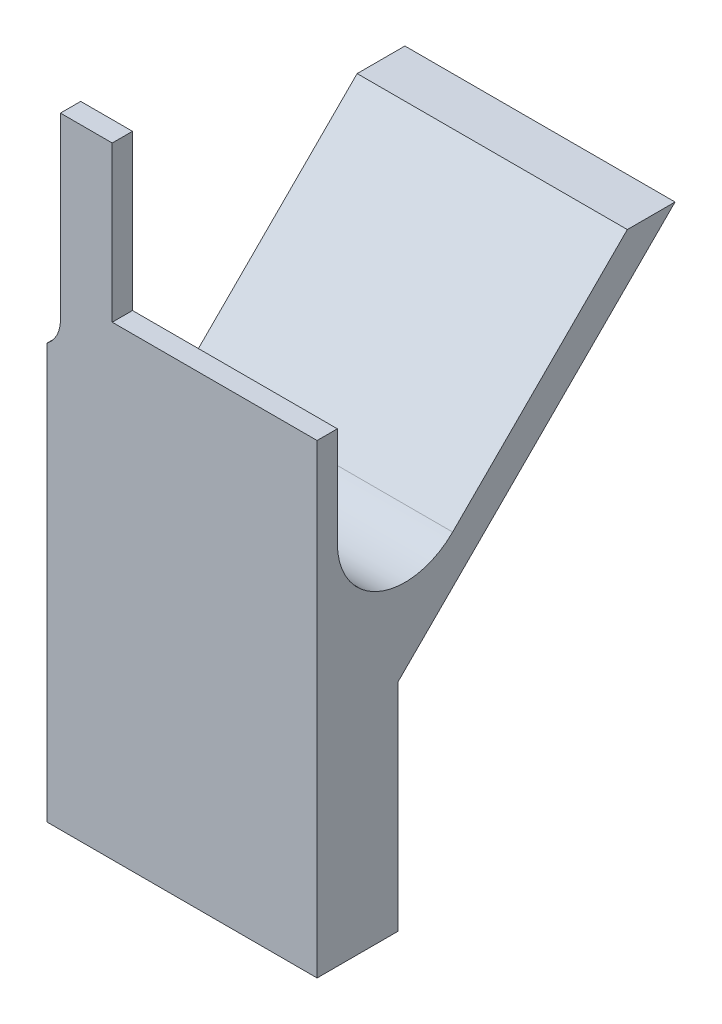
ISO-10303-21;
HEADER;
FILE_DESCRIPTION(('STEP AP214'),'2;1');
FILE_NAME('part.step','',(''),(''),'','','');
FILE_SCHEMA(('AUTOMOTIVE_DESIGN { 1 0 10303 214 1 1 1 1 }'));
ENDSEC;
DATA;
#1=APPLICATION_CONTEXT('core data for automotive mechanical design processes');
#2=APPLICATION_PROTOCOL_DEFINITION('international standard','automotive_design',2000,#1);
#3=PRODUCT_CONTEXT('',#1,'mechanical');
#4=PRODUCT('Part','Part','',(#3));
#5=PRODUCT_RELATED_PRODUCT_CATEGORY('part','',(#4));
#6=PRODUCT_DEFINITION_FORMATION('','',#4);
#7=PRODUCT_DEFINITION_CONTEXT('part definition',#1,'design');
#8=PRODUCT_DEFINITION('design','',#6,#7);
#9=PRODUCT_DEFINITION_SHAPE('','',#8);
#10=(LENGTH_UNIT() NAMED_UNIT(*) SI_UNIT(.MILLI.,.METRE.));
#11=(NAMED_UNIT(*) PLANE_ANGLE_UNIT() SI_UNIT($,.RADIAN.));
#12=(NAMED_UNIT(*) SI_UNIT($,.STERADIAN.) SOLID_ANGLE_UNIT());
#13=UNCERTAINTY_MEASURE_WITH_UNIT(LENGTH_MEASURE(1.E-05),#10,'distance_accuracy_value','');
#14=(GEOMETRIC_REPRESENTATION_CONTEXT(3) GLOBAL_UNCERTAINTY_ASSIGNED_CONTEXT((#13)) GLOBAL_UNIT_ASSIGNED_CONTEXT((#10,
#11,#12)) REPRESENTATION_CONTEXT('',''));
#15=CARTESIAN_POINT('',(0.,0.,0.));
#16=DIRECTION('',(0.,0.,1.));
#17=DIRECTION('',(1.,0.,0.));
#18=AXIS2_PLACEMENT_3D('',#15,#16,#17);
#19=CARTESIAN_POINT('',(0.,0.,12.));
#20=DIRECTION('',(1.,0.,0.));
#21=DIRECTION('',(0.,0.,-1.));
#22=AXIS2_PLACEMENT_3D('',#19,#20,#21);
#23=PLANE('',#22);
#24=DIRECTION('',(0.,0.707106781186547,-0.707106781186547));
#25=VECTOR('',#24,1.);
#26=CARTESIAN_POINT('',(0.,83.4142135623731,-44.3431457505076));
#27=LINE('',#26,#25);
#28=CARTESIAN_POINT('',(0.,47.142135623731,-8.07106781186548));
#29=VERTEX_POINT('',#28);
#30=CARTESIAN_POINT('',(0.,73.0000000000004,-33.9289321881349));
#31=VERTEX_POINT('',#30);
#32=EDGE_CURVE('E143',#29,#31,#27,.T.);
#33=ORIENTED_EDGE('',*,*,#32,.T.);
#34=DIRECTION('',(0.,0.,-1.));
#35=VECTOR('',#34,1.);
#36=CARTESIAN_POINT('',(0.,73.0000000000004,12.));
#37=LINE('',#36,#35);
#38=CARTESIAN_POINT('',(0.,73.0000000000004,-40.9999999999997));
#39=VERTEX_POINT('',#38);
#40=EDGE_CURVE('E135',#31,#39,#37,.T.);
#41=ORIENTED_EDGE('',*,*,#40,.T.);
#42=DIRECTION('',(0.,-0.707106781186549,0.707106781186546));
#43=VECTOR('',#42,1.);
#44=CARTESIAN_POINT('',(0.,82.0000000000005,-49.9999999999998));
#45=LINE('',#44,#43);
#46=CARTESIAN_POINT('',(0.,32.0000000000003,1.66533453693773E-13));
#47=VERTEX_POINT('',#46);
#48=EDGE_CURVE('E141',#39,#47,#45,.T.);
#49=ORIENTED_EDGE('',*,*,#48,.T.);
#50=DIRECTION('',(0.,-1.,0.));
#51=VECTOR('',#50,1.);
#52=CARTESIAN_POINT('',(0.,0.,0.));
#53=LINE('',#52,#51);
#54=CARTESIAN_POINT('',(0.,0.,0.));
#55=VERTEX_POINT('',#54);
#56=EDGE_CURVE('E175',#47,#55,#53,.T.);
#57=ORIENTED_EDGE('',*,*,#56,.T.);
#58=DIRECTION('',(0.,0.,-1.));
#59=VECTOR('',#58,1.);
#60=CARTESIAN_POINT('',(0.,0.,12.));
#61=LINE('',#60,#59);
#62=CARTESIAN_POINT('',(0.,0.,12.));
#63=VERTEX_POINT('',#62);
#64=EDGE_CURVE('E197',#63,#55,#61,.T.);
#65=ORIENTED_EDGE('',*,*,#64,.F.);
#66=DIRECTION('',(0.,-1.,0.));
#67=VECTOR('',#66,1.);
#68=CARTESIAN_POINT('',(0.,0.,12.));
#69=LINE('',#68,#67);
#70=CARTESIAN_POINT('',(0.,61.4,12.));
#71=VERTEX_POINT('',#70);
#72=EDGE_CURVE('E180',#71,#63,#69,.T.);
#73=ORIENTED_EDGE('',*,*,#72,.F.);
#74=DIRECTION('',(0.,0.,1.));
#75=VECTOR('',#74,1.);
#76=CARTESIAN_POINT('',(0.,61.4,9.));
#77=LINE('',#76,#75);
#78=CARTESIAN_POINT('',(0.,61.4,9.));
#79=VERTEX_POINT('',#78);
#80=EDGE_CURVE('E172',#79,#71,#77,.T.);
#81=ORIENTED_EDGE('',*,*,#80,.F.);
#82=DIRECTION('',(0.,-1.,0.));
#83=VECTOR('',#82,1.);
#84=CARTESIAN_POINT('',(0.,61.4,9.));
#85=LINE('',#84,#83);
#86=CARTESIAN_POINT('',(0.,54.2132034355964,9.));
#87=VERTEX_POINT('',#86);
#88=EDGE_CURVE('E167',#79,#87,#85,.T.);
#89=ORIENTED_EDGE('',*,*,#88,.T.);
#90=CARTESIAN_POINT('',(0.,54.2132034355964,-0.999999999999999));
#91=DIRECTION('',(1.,0.,0.));
#92=DIRECTION('',(0.,0.,-1.));
#93=AXIS2_PLACEMENT_3D('',#90,#91,#92);
#94=CIRCLE('',#93,10.);
#95=EDGE_CURVE('E63',#87,#29,#94,.T.);
#96=ORIENTED_EDGE('',*,*,#95,.T.);
#97=EDGE_LOOP('',(#33,#41,#49,#57,#65,#73,#81,#89,#96));
#98=FACE_BOUND('',#97,.T.);
#99=ADVANCED_FACE('F41',(#98),#23,.F.);
#100=CARTESIAN_POINT('',(40.,0.,12.));
#101=DIRECTION('',(-1.,0.,0.));
#102=DIRECTION('',(0.,0.,1.));
#103=AXIS2_PLACEMENT_3D('',#100,#101,#102);
#104=PLANE('',#103);
#105=DIRECTION('',(0.,-0.707106781186549,0.707106781186546));
#106=VECTOR('',#105,1.);
#107=CARTESIAN_POINT('',(40.,82.0000000000005,-49.9999999999998));
#108=LINE('',#107,#106);
#109=CARTESIAN_POINT('',(40.,73.0000000000004,-40.9999999999997));
#110=VERTEX_POINT('',#109);
#111=CARTESIAN_POINT('',(40.,32.0000000000003,1.66533453693773E-13));
#112=VERTEX_POINT('',#111);
#113=EDGE_CURVE('E152',#110,#112,#108,.T.);
#114=ORIENTED_EDGE('',*,*,#113,.F.);
#115=DIRECTION('',(0.,0.,1.));
#116=VECTOR('',#115,1.);
#117=CARTESIAN_POINT('',(40.,73.0000000000004,12.));
#118=LINE('',#117,#116);
#119=CARTESIAN_POINT('',(40.,73.0000000000004,-33.9289321881349));
#120=VERTEX_POINT('',#119);
#121=EDGE_CURVE('E55',#110,#120,#118,.T.);
#122=ORIENTED_EDGE('',*,*,#121,.T.);
#123=DIRECTION('',(0.,0.707106781186548,-0.707106781186548));
#124=VECTOR('',#123,1.);
#125=CARTESIAN_POINT('',(40.,83.4142135623731,-44.3431457505076));
#126=LINE('',#125,#124);
#127=CARTESIAN_POINT('',(40.,47.1421356237309,-8.07106781186547));
#128=VERTEX_POINT('',#127);
#129=EDGE_CURVE('E159',#128,#120,#126,.T.);
#130=ORIENTED_EDGE('',*,*,#129,.F.);
#131=CARTESIAN_POINT('',(40.,54.2132034355964,-0.999999999999999));
#132=DIRECTION('',(-1.,0.,0.));
#133=DIRECTION('',(0.,0.,1.));
#134=AXIS2_PLACEMENT_3D('',#131,#132,#133);
#135=CIRCLE('',#134,10.);
#136=CARTESIAN_POINT('',(40.,54.2132034355964,9.));
#137=VERTEX_POINT('',#136);
#138=EDGE_CURVE('E49',#128,#137,#135,.T.);
#139=ORIENTED_EDGE('',*,*,#138,.T.);
#140=DIRECTION('',(0.,1.,0.));
#141=VECTOR('',#140,1.);
#142=CARTESIAN_POINT('',(40.,68.92,9.));
#143=LINE('',#142,#141);
#144=CARTESIAN_POINT('',(40.,68.92,9.));
#145=VERTEX_POINT('',#144);
#146=EDGE_CURVE('E163',#137,#145,#143,.T.);
#147=ORIENTED_EDGE('',*,*,#146,.T.);
#148=DIRECTION('',(0.,0.,1.));
#149=VECTOR('',#148,1.);
#150=CARTESIAN_POINT('',(40.,68.92,9.));
#151=LINE('',#150,#149);
#152=CARTESIAN_POINT('',(40.,68.92,12.));
#153=VERTEX_POINT('',#152);
#154=EDGE_CURVE('E169',#145,#153,#151,.T.);
#155=ORIENTED_EDGE('',*,*,#154,.T.);
#156=DIRECTION('',(0.,1.,0.));
#157=VECTOR('',#156,1.);
#158=CARTESIAN_POINT('',(40.,0.,12.));
#159=LINE('',#158,#157);
#160=CARTESIAN_POINT('',(40.,0.,12.));
#161=VERTEX_POINT('',#160);
#162=EDGE_CURVE('E185',#161,#153,#159,.T.);
#163=ORIENTED_EDGE('',*,*,#162,.F.);
#164=DIRECTION('',(0.,0.,-1.));
#165=VECTOR('',#164,1.);
#166=CARTESIAN_POINT('',(40.,0.,12.));
#167=LINE('',#166,#165);
#168=CARTESIAN_POINT('',(40.,0.,0.));
#169=VERTEX_POINT('',#168);
#170=EDGE_CURVE('E187',#161,#169,#167,.T.);
#171=ORIENTED_EDGE('',*,*,#170,.T.);
#172=DIRECTION('',(0.,1.,0.));
#173=VECTOR('',#172,1.);
#174=CARTESIAN_POINT('',(40.,0.,0.));
#175=LINE('',#174,#173);
#176=EDGE_CURVE('E191',#169,#112,#175,.T.);
#177=ORIENTED_EDGE('',*,*,#176,.T.);
#178=EDGE_LOOP('',(#114,#122,#130,#139,#147,#155,#163,#171,#177));
#179=FACE_BOUND('',#178,.T.);
#180=ADVANCED_FACE('F209',(#179),#104,.F.);
#181=CARTESIAN_POINT('',(0.,0.,12.));
#182=DIRECTION('',(0.,1.,0.));
#183=DIRECTION('',(0.,0.,1.));
#184=AXIS2_PLACEMENT_3D('',#181,#182,#183);
#185=PLANE('',#184);
#186=DIRECTION('',(1.,0.,0.));
#187=VECTOR('',#186,1.);
#188=CARTESIAN_POINT('',(0.,0.,0.));
#189=LINE('',#188,#187);
#190=EDGE_CURVE('E189',#55,#169,#189,.T.);
#191=ORIENTED_EDGE('',*,*,#190,.T.);
#192=ORIENTED_EDGE('',*,*,#170,.F.);
#193=DIRECTION('',(1.,0.,0.));
#194=VECTOR('',#193,1.);
#195=CARTESIAN_POINT('',(0.,0.,12.));
#196=LINE('',#195,#194);
#197=EDGE_CURVE('E183',#63,#161,#196,.T.);
#198=ORIENTED_EDGE('',*,*,#197,.F.);
#199=ORIENTED_EDGE('',*,*,#64,.T.);
#200=EDGE_LOOP('',(#191,#192,#198,#199));
#201=FACE_BOUND('',#200,.T.);
#202=ADVANCED_FACE('F271',(#201),#185,.F.);
#203=CARTESIAN_POINT('',(0.,0.,12.));
#204=DIRECTION('',(0.,0.,-1.));
#205=DIRECTION('',(-1.,0.,0.));
#206=AXIS2_PLACEMENT_3D('',#203,#204,#205);
#207=PLANE('',#206);
#208=CARTESIAN_POINT('',(-3.00000000000009,65.4000000000001,12.));
#209=DIRECTION('',(0.,0.,1.));
#210=DIRECTION('',(1.,0.,0.));
#211=AXIS2_PLACEMENT_3D('',#208,#209,#210);
#212=CIRCLE('',#211,5.00000000000013);
#213=CARTESIAN_POINT('',(2.00000000000004,65.4,12.));
#214=VERTEX_POINT('',#213);
#215=EDGE_CURVE('E223',#71,#214,#212,.T.);
#216=ORIENTED_EDGE('',*,*,#215,.F.);
#217=ORIENTED_EDGE('',*,*,#72,.T.);
#218=ORIENTED_EDGE('',*,*,#197,.T.);
#219=ORIENTED_EDGE('',*,*,#162,.T.);
#220=DIRECTION('',(-1.,0.,0.));
#221=VECTOR('',#220,1.);
#222=CARTESIAN_POINT('',(40.,68.92,12.));
#223=LINE('',#222,#221);
#224=CARTESIAN_POINT('',(9.67000000000001,68.92,12.));
#225=VERTEX_POINT('',#224);
#226=EDGE_CURVE('E162',#153,#225,#223,.T.);
#227=ORIENTED_EDGE('',*,*,#226,.T.);
#228=DIRECTION('',(0.,-1.,0.));
#229=VECTOR('',#228,1.);
#230=CARTESIAN_POINT('',(9.67000000000001,61.4,12.));
#231=LINE('',#230,#229);
#232=CARTESIAN_POINT('',(9.67,91.9000000000005,12.));
#233=VERTEX_POINT('',#232);
#234=EDGE_CURVE('E220',#233,#225,#231,.T.);
#235=ORIENTED_EDGE('',*,*,#234,.F.);
#236=DIRECTION('',(1.,0.,0.));
#237=VECTOR('',#236,1.);
#238=CARTESIAN_POINT('',(9.67,91.9000000000005,12.));
#239=LINE('',#238,#237);
#240=CARTESIAN_POINT('',(2.00000000000008,91.9000000000005,12.));
#241=VERTEX_POINT('',#240);
#242=EDGE_CURVE('E230',#241,#233,#239,.T.);
#243=ORIENTED_EDGE('',*,*,#242,.F.);
#244=DIRECTION('',(0.,1.,0.));
#245=VECTOR('',#244,1.);
#246=CARTESIAN_POINT('',(2.00000000000008,91.9000000000005,12.));
#247=LINE('',#246,#245);
#248=EDGE_CURVE('E238',#214,#241,#247,.T.);
#249=ORIENTED_EDGE('',*,*,#248,.F.);
#250=EDGE_LOOP('',(#216,#217,#218,#219,#227,#235,#243,#249));
#251=FACE_BOUND('',#250,.T.);
#252=ADVANCED_FACE('F256',(#251),#207,.F.);
#253=CARTESIAN_POINT('',(0.,0.,0.));
#254=DIRECTION('',(0.,0.,-1.));
#255=DIRECTION('',(-1.,0.,0.));
#256=AXIS2_PLACEMENT_3D('',#253,#254,#255);
#257=PLANE('',#256);
#258=ORIENTED_EDGE('',*,*,#56,.F.);
#259=DIRECTION('',(-1.,0.,0.));
#260=VECTOR('',#259,1.);
#261=CARTESIAN_POINT('',(0.,32.,0.));
#262=LINE('',#261,#260);
#263=EDGE_CURVE('E148',#112,#47,#262,.T.);
#264=ORIENTED_EDGE('',*,*,#263,.F.);
#265=ORIENTED_EDGE('',*,*,#176,.F.);
#266=ORIENTED_EDGE('',*,*,#190,.F.);
#267=EDGE_LOOP('',(#258,#264,#265,#266));
#268=FACE_BOUND('',#267,.T.);
#269=ADVANCED_FACE('F277',(#268),#257,.T.);
#270=CARTESIAN_POINT('',(40.,68.92,9.));
#271=DIRECTION('',(0.,1.,0.));
#272=DIRECTION('',(0.,0.,1.));
#273=AXIS2_PLACEMENT_3D('',#270,#271,#272);
#274=PLANE('',#273);
#275=ORIENTED_EDGE('',*,*,#226,.F.);
#276=ORIENTED_EDGE('',*,*,#154,.F.);
#277=DIRECTION('',(-1.,0.,0.));
#278=VECTOR('',#277,1.);
#279=CARTESIAN_POINT('',(40.,68.92,9.));
#280=LINE('',#279,#278);
#281=CARTESIAN_POINT('',(9.67000000000001,68.92,9.));
#282=VERTEX_POINT('',#281);
#283=EDGE_CURVE('E165',#145,#282,#280,.T.);
#284=ORIENTED_EDGE('',*,*,#283,.T.);
#285=DIRECTION('',(0.,0.,1.));
#286=VECTOR('',#285,1.);
#287=CARTESIAN_POINT('',(9.67000000000001,68.92,9.));
#288=LINE('',#287,#286);
#289=EDGE_CURVE('E176',#282,#225,#288,.T.);
#290=ORIENTED_EDGE('',*,*,#289,.T.);
#291=EDGE_LOOP('',(#275,#276,#284,#290));
#292=FACE_BOUND('',#291,.T.);
#293=ADVANCED_FACE('F275',(#292),#274,.T.);
#294=CARTESIAN_POINT('',(0.,0.,9.));
#295=DIRECTION('',(0.,0.,-1.));
#296=DIRECTION('',(-1.,0.,0.));
#297=AXIS2_PLACEMENT_3D('',#294,#295,#296);
#298=PLANE('',#297);
#299=ORIENTED_EDGE('',*,*,#146,.F.);
#300=DIRECTION('',(-1.,0.,0.));
#301=VECTOR('',#300,1.);
#302=CARTESIAN_POINT('',(0.,54.2132034355964,9.));
#303=LINE('',#302,#301);
#304=EDGE_CURVE('E200',#137,#87,#303,.T.);
#305=ORIENTED_EDGE('',*,*,#304,.T.);
#306=ORIENTED_EDGE('',*,*,#88,.F.);
#307=CARTESIAN_POINT('',(-3.00000000000009,65.4000000000001,9.));
#308=DIRECTION('',(0.,0.,1.));
#309=DIRECTION('',(1.,0.,0.));
#310=AXIS2_PLACEMENT_3D('',#307,#308,#309);
#311=CIRCLE('',#310,5.00000000000013);
#312=CARTESIAN_POINT('',(2.00000000000004,65.4,9.));
#313=VERTEX_POINT('',#312);
#314=EDGE_CURVE('E229',#79,#313,#311,.T.);
#315=ORIENTED_EDGE('',*,*,#314,.T.);
#316=DIRECTION('',(0.,1.,0.));
#317=VECTOR('',#316,1.);
#318=CARTESIAN_POINT('',(2.00000000000008,91.9000000000005,9.));
#319=LINE('',#318,#317);
#320=CARTESIAN_POINT('',(2.00000000000008,91.9000000000005,9.));
#321=VERTEX_POINT('',#320);
#322=EDGE_CURVE('E232',#313,#321,#319,.T.);
#323=ORIENTED_EDGE('',*,*,#322,.T.);
#324=DIRECTION('',(1.,0.,0.));
#325=VECTOR('',#324,1.);
#326=CARTESIAN_POINT('',(9.67,91.9000000000005,9.));
#327=LINE('',#326,#325);
#328=CARTESIAN_POINT('',(9.67,91.9000000000005,9.));
#329=VERTEX_POINT('',#328);
#330=EDGE_CURVE('E234',#321,#329,#327,.T.);
#331=ORIENTED_EDGE('',*,*,#330,.T.);
#332=DIRECTION('',(0.,-1.,0.));
#333=VECTOR('',#332,1.);
#334=CARTESIAN_POINT('',(9.67000000000001,61.4,9.));
#335=LINE('',#334,#333);
#336=EDGE_CURVE('E227',#329,#282,#335,.T.);
#337=ORIENTED_EDGE('',*,*,#336,.T.);
#338=ORIENTED_EDGE('',*,*,#283,.F.);
#339=EDGE_LOOP('',(#299,#305,#306,#315,#323,#331,#337,#338));
#340=FACE_BOUND('',#339,.T.);
#341=ADVANCED_FACE('F216',(#340),#298,.T.);
#342=CARTESIAN_POINT('',(117.559017089912,83.4142135623731,-44.3431457505076));
#343=DIRECTION('',(0.,0.707106781186548,0.707106781186548));
#344=DIRECTION('',(0.,-0.707106781186548,0.707106781186548));
#345=AXIS2_PLACEMENT_3D('',#342,#343,#344);
#346=PLANE('',#345);
#347=DIRECTION('',(1.,0.,0.));
#348=VECTOR('',#347,1.);
#349=CARTESIAN_POINT('',(117.559017089912,73.0000000000004,-33.9289321881349));
#350=LINE('',#349,#348);
#351=EDGE_CURVE('E144',#31,#120,#350,.T.);
#352=ORIENTED_EDGE('',*,*,#351,.F.);
#353=ORIENTED_EDGE('',*,*,#32,.F.);
#354=DIRECTION('',(-1.,0.,0.));
#355=VECTOR('',#354,1.);
#356=CARTESIAN_POINT('',(0.,47.1421356237309,-8.07106781186547));
#357=LINE('',#356,#355);
#358=EDGE_CURVE('E203',#29,#128,#357,.F.);
#359=ORIENTED_EDGE('',*,*,#358,.T.);
#360=ORIENTED_EDGE('',*,*,#129,.T.);
#361=EDGE_LOOP('',(#352,#353,#359,#360));
#362=FACE_BOUND('',#361,.T.);
#363=ADVANCED_FACE('F219',(#362),#346,.T.);
#364=CARTESIAN_POINT('',(117.559017089912,82.0000000000005,-49.9999999999998));
#365=DIRECTION('',(0.,-0.707106781186546,-0.707106781186549));
#366=DIRECTION('',(0.,0.707106781186549,-0.707106781186546));
#367=AXIS2_PLACEMENT_3D('',#364,#365,#366);
#368=PLANE('',#367);
#369=DIRECTION('',(-1.,0.,0.));
#370=VECTOR('',#369,1.);
#371=CARTESIAN_POINT('',(117.559017089912,73.0000000000004,-40.9999999999997));
#372=LINE('',#371,#370);
#373=EDGE_CURVE('E11',#110,#39,#372,.T.);
#374=ORIENTED_EDGE('',*,*,#373,.F.);
#375=ORIENTED_EDGE('',*,*,#113,.T.);
#376=ORIENTED_EDGE('',*,*,#263,.T.);
#377=ORIENTED_EDGE('',*,*,#48,.F.);
#378=EDGE_LOOP('',(#374,#375,#376,#377));
#379=FACE_BOUND('',#378,.T.);
#380=ADVANCED_FACE('F146',(#379),#368,.T.);
#381=CARTESIAN_POINT('',(0.,54.2132034355964,-0.999999999999999));
#382=DIRECTION('',(1.,0.,0.));
#383=DIRECTION('',(0.,0.,-1.));
#384=AXIS2_PLACEMENT_3D('',#381,#382,#383);
#385=CYLINDRICAL_SURFACE('',#384,10.);
#386=ORIENTED_EDGE('',*,*,#138,.F.);
#387=ORIENTED_EDGE('',*,*,#358,.F.);
#388=ORIENTED_EDGE('',*,*,#95,.F.);
#389=ORIENTED_EDGE('',*,*,#304,.F.);
#390=EDGE_LOOP('',(#386,#387,#388,#389));
#391=FACE_BOUND('',#390,.T.);
#392=ADVANCED_FACE('F43',(#391),#385,.F.);
#393=CARTESIAN_POINT('',(9.67000000000001,61.4,9.));
#394=DIRECTION('',(-1.,0.,0.));
#395=DIRECTION('',(0.,-1.,0.));
#396=AXIS2_PLACEMENT_3D('',#393,#394,#395);
#397=PLANE('',#396);
#398=ORIENTED_EDGE('',*,*,#289,.F.);
#399=ORIENTED_EDGE('',*,*,#336,.F.);
#400=DIRECTION('',(0.,0.,1.));
#401=VECTOR('',#400,1.);
#402=CARTESIAN_POINT('',(9.67,91.9000000000005,9.));
#403=LINE('',#402,#401);
#404=EDGE_CURVE('E235',#329,#233,#403,.T.);
#405=ORIENTED_EDGE('',*,*,#404,.T.);
#406=ORIENTED_EDGE('',*,*,#234,.T.);
#407=EDGE_LOOP('',(#398,#399,#405,#406));
#408=FACE_BOUND('',#407,.T.);
#409=ADVANCED_FACE('F260',(#408),#397,.F.);
#410=CARTESIAN_POINT('',(-3.00000000000009,65.4000000000001,9.));
#411=DIRECTION('',(0.,0.,1.));
#412=DIRECTION('',(1.,0.,0.));
#413=AXIS2_PLACEMENT_3D('',#410,#411,#412);
#414=CYLINDRICAL_SURFACE('',#413,5.00000000000013);
#415=ORIENTED_EDGE('',*,*,#215,.T.);
#416=DIRECTION('',(0.,0.,1.));
#417=VECTOR('',#416,1.);
#418=CARTESIAN_POINT('',(2.00000000000004,65.4,9.));
#419=LINE('',#418,#417);
#420=EDGE_CURVE('E150',#313,#214,#419,.T.);
#421=ORIENTED_EDGE('',*,*,#420,.F.);
#422=ORIENTED_EDGE('',*,*,#314,.F.);
#423=ORIENTED_EDGE('',*,*,#80,.T.);
#424=EDGE_LOOP('',(#415,#421,#422,#423));
#425=FACE_BOUND('',#424,.T.);
#426=ADVANCED_FACE('F266',(#425),#414,.F.);
#427=CARTESIAN_POINT('',(2.00000000000008,91.9000000000005,9.));
#428=DIRECTION('',(1.,0.,0.));
#429=DIRECTION('',(0.,1.,0.));
#430=AXIS2_PLACEMENT_3D('',#427,#428,#429);
#431=PLANE('',#430);
#432=ORIENTED_EDGE('',*,*,#248,.T.);
#433=DIRECTION('',(0.,0.,1.));
#434=VECTOR('',#433,1.);
#435=CARTESIAN_POINT('',(2.00000000000008,91.9000000000005,9.));
#436=LINE('',#435,#434);
#437=EDGE_CURVE('E155',#321,#241,#436,.T.);
#438=ORIENTED_EDGE('',*,*,#437,.F.);
#439=ORIENTED_EDGE('',*,*,#322,.F.);
#440=ORIENTED_EDGE('',*,*,#420,.T.);
#441=EDGE_LOOP('',(#432,#438,#439,#440));
#442=FACE_BOUND('',#441,.T.);
#443=ADVANCED_FACE('F264',(#442),#431,.F.);
#444=CARTESIAN_POINT('',(9.67,91.9000000000005,9.));
#445=DIRECTION('',(0.,-1.,0.));
#446=DIRECTION('',(0.,0.,-1.));
#447=AXIS2_PLACEMENT_3D('',#444,#445,#446);
#448=PLANE('',#447);
#449=ORIENTED_EDGE('',*,*,#242,.T.);
#450=ORIENTED_EDGE('',*,*,#404,.F.);
#451=ORIENTED_EDGE('',*,*,#330,.F.);
#452=ORIENTED_EDGE('',*,*,#437,.T.);
#453=EDGE_LOOP('',(#449,#450,#451,#452));
#454=FACE_BOUND('',#453,.T.);
#455=ADVANCED_FACE('F248',(#454),#448,.F.);
#456=CARTESIAN_POINT('',(-10.,73.0000000000004,-31.9983645956158));
#457=DIRECTION('',(0.,-1.,0.));
#458=DIRECTION('',(0.,0.,-1.));
#459=AXIS2_PLACEMENT_3D('',#456,#457,#458);
#460=PLANE('',#459);
#461=ORIENTED_EDGE('',*,*,#351,.T.);
#462=ORIENTED_EDGE('',*,*,#121,.F.);
#463=ORIENTED_EDGE('',*,*,#373,.T.);
#464=ORIENTED_EDGE('',*,*,#40,.F.);
#465=EDGE_LOOP('',(#461,#462,#463,#464));
#466=FACE_BOUND('',#465,.T.);
#467=ADVANCED_FACE('F134',(#466),#460,.F.);
#468=CLOSED_SHELL('',(#99,#180,#202,#252,#269,#293,#341,#363,#380,#392,#409,#426,#443,#455,#467));
#469=MANIFOLD_SOLID_BREP('B2',#468);
#470=ADVANCED_BREP_SHAPE_REPRESENTATION('',(#18,#469),#14);
#471=SHAPE_DEFINITION_REPRESENTATION(#9,#470);
ENDSEC;
END-ISO-10303-21;
